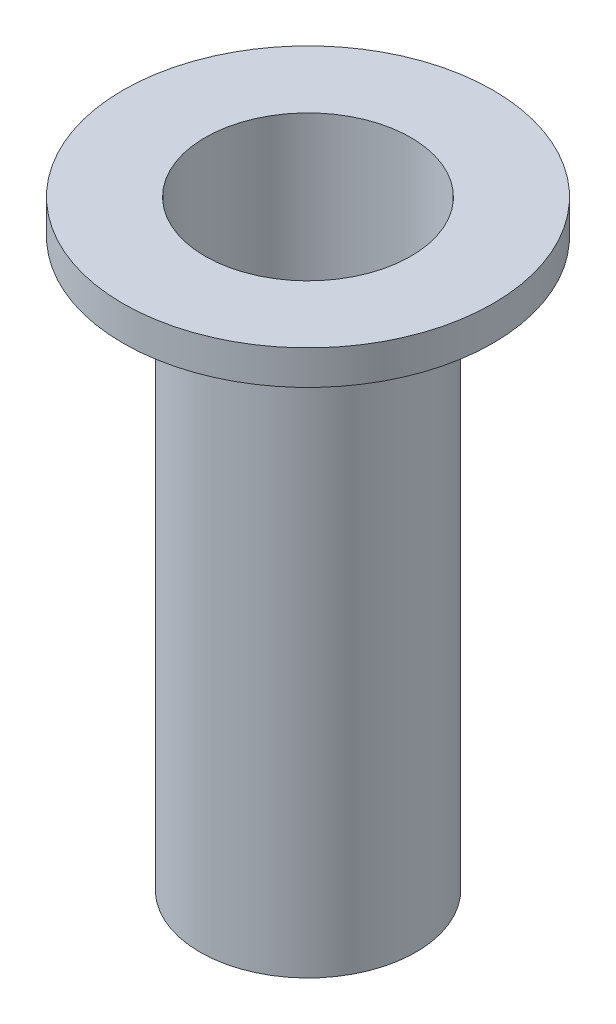
ISO-10303-21;
HEADER;
FILE_DESCRIPTION(('STEP AP214'),'2;1');
FILE_NAME('part.step','',(''),(''),'','','');
FILE_SCHEMA(('AUTOMOTIVE_DESIGN { 1 0 10303 214 1 1 1 1 }'));
ENDSEC;
DATA;
#1=APPLICATION_CONTEXT('core data for automotive mechanical design processes');
#2=APPLICATION_PROTOCOL_DEFINITION('international standard','automotive_design',2000,#1);
#3=PRODUCT_CONTEXT('',#1,'mechanical');
#4=PRODUCT('Part','Part','',(#3));
#5=PRODUCT_RELATED_PRODUCT_CATEGORY('part','',(#4));
#6=PRODUCT_DEFINITION_FORMATION('','',#4);
#7=PRODUCT_DEFINITION_CONTEXT('part definition',#1,'design');
#8=PRODUCT_DEFINITION('design','',#6,#7);
#9=PRODUCT_DEFINITION_SHAPE('','',#8);
#10=(LENGTH_UNIT() NAMED_UNIT(*) SI_UNIT(.MILLI.,.METRE.));
#11=(NAMED_UNIT(*) PLANE_ANGLE_UNIT() SI_UNIT($,.RADIAN.));
#12=(NAMED_UNIT(*) SI_UNIT($,.STERADIAN.) SOLID_ANGLE_UNIT());
#13=UNCERTAINTY_MEASURE_WITH_UNIT(LENGTH_MEASURE(1.E-05),#10,'distance_accuracy_value','');
#14=(GEOMETRIC_REPRESENTATION_CONTEXT(3) GLOBAL_UNCERTAINTY_ASSIGNED_CONTEXT((#13)) GLOBAL_UNIT_ASSIGNED_CONTEXT((#10,
#11,#12)) REPRESENTATION_CONTEXT('',''));
#15=CARTESIAN_POINT('',(0.,0.,0.));
#16=DIRECTION('',(0.,0.,1.));
#17=DIRECTION('',(1.,0.,0.));
#18=AXIS2_PLACEMENT_3D('',#15,#16,#17);
#19=CARTESIAN_POINT('',(0.,44.45,0.));
#20=DIRECTION('',(0.,-1.,0.));
#21=DIRECTION('',(0.,0.,-1.));
#22=AXIS2_PLACEMENT_3D('',#19,#20,#21);
#23=CYLINDRICAL_SURFACE('',#22,8.001);
#24=CARTESIAN_POINT('',(0.,40.9902955565163,0.));
#25=DIRECTION('',(0.,-1.,0.));
#26=DIRECTION('',(0.,0.,-1.));
#27=AXIS2_PLACEMENT_3D('',#24,#25,#26);
#28=CIRCLE('',#27,8.001);
#29=CARTESIAN_POINT('',(0.,40.9902955565163,-8.001));
#30=VERTEX_POINT('',#29);
#31=EDGE_CURVE('E56',#30,#30,#28,.T.);
#32=ORIENTED_EDGE('',*,*,#31,.T.);
#33=EDGE_LOOP('',(#32));
#34=FACE_BOUND('',#33,.T.);
#35=CARTESIAN_POINT('',(0.,0.,0.));
#36=DIRECTION('',(0.,1.,0.));
#37=DIRECTION('',(0.,0.,1.));
#38=AXIS2_PLACEMENT_3D('',#35,#36,#37);
#39=CIRCLE('',#38,8.001);
#40=CARTESIAN_POINT('',(0.,0.,8.001));
#41=VERTEX_POINT('',#40);
#42=EDGE_CURVE('E40',#41,#41,#39,.T.);
#43=ORIENTED_EDGE('',*,*,#42,.T.);
#44=EDGE_LOOP('',(#43));
#45=FACE_BOUND('',#44,.T.);
#46=ADVANCED_FACE('F33',(#34,#45),#23,.T.);
#47=CARTESIAN_POINT('',(0.,44.45,0.));
#48=DIRECTION('',(0.,1.,0.));
#49=DIRECTION('',(0.,0.,1.));
#50=AXIS2_PLACEMENT_3D('',#47,#48,#49);
#51=PLANE('',#50);
#52=CARTESIAN_POINT('',(0.,44.45,0.));
#53=DIRECTION('',(0.,1.,0.));
#54=DIRECTION('',(0.,0.,1.));
#55=AXIS2_PLACEMENT_3D('',#52,#53,#54);
#56=CIRCLE('',#55,7.62);
#57=CARTESIAN_POINT('',(0.,44.45,7.62));
#58=VERTEX_POINT('',#57);
#59=EDGE_CURVE('E48',#58,#58,#56,.T.);
#60=ORIENTED_EDGE('',*,*,#59,.F.);
#61=EDGE_LOOP('',(#60));
#62=FACE_BOUND('',#61,.T.);
#63=CARTESIAN_POINT('',(0.,44.45,0.));
#64=DIRECTION('',(0.,-1.,0.));
#65=DIRECTION('',(0.,0.,-1.));
#66=AXIS2_PLACEMENT_3D('',#63,#64,#65);
#67=CIRCLE('',#66,13.6980056010222);
#68=CARTESIAN_POINT('',(0.,44.45,-13.6980056010222));
#69=VERTEX_POINT('',#68);
#70=EDGE_CURVE('E62',#69,#69,#67,.T.);
#71=ORIENTED_EDGE('',*,*,#70,.F.);
#72=EDGE_LOOP('',(#71));
#73=FACE_BOUND('',#72,.T.);
#74=ADVANCED_FACE('F69',(#62,#73),#51,.T.);
#75=CARTESIAN_POINT('',(0.,0.,0.));
#76=DIRECTION('',(0.,1.,0.));
#77=DIRECTION('',(0.,0.,1.));
#78=AXIS2_PLACEMENT_3D('',#75,#76,#77);
#79=PLANE('',#78);
#80=CARTESIAN_POINT('',(0.,0.,0.));
#81=DIRECTION('',(0.,1.,0.));
#82=DIRECTION('',(0.,0.,1.));
#83=AXIS2_PLACEMENT_3D('',#80,#81,#82);
#84=CIRCLE('',#83,7.62);
#85=CARTESIAN_POINT('',(0.,0.,7.62));
#86=VERTEX_POINT('',#85);
#87=EDGE_CURVE('E10',#86,#86,#84,.T.);
#88=ORIENTED_EDGE('',*,*,#87,.T.);
#89=EDGE_LOOP('',(#88));
#90=FACE_BOUND('',#89,.T.);
#91=ORIENTED_EDGE('',*,*,#42,.F.);
#92=EDGE_LOOP('',(#91));
#93=FACE_BOUND('',#92,.T.);
#94=ADVANCED_FACE('F71',(#90,#93),#79,.F.);
#95=CARTESIAN_POINT('',(0.,1.27,0.));
#96=DIRECTION('',(0.,1.,0.));
#97=DIRECTION('',(0.,0.,1.));
#98=AXIS2_PLACEMENT_3D('',#95,#96,#97);
#99=CYLINDRICAL_SURFACE('',#98,7.62);
#100=CARTESIAN_POINT('',(0.,1.27,0.));
#101=DIRECTION('',(0.,1.,0.));
#102=DIRECTION('',(0.,0.,1.));
#103=AXIS2_PLACEMENT_3D('',#100,#101,#102);
#104=CIRCLE('',#103,7.62);
#105=CARTESIAN_POINT('',(0.,1.27,7.62));
#106=VERTEX_POINT('',#105);
#107=EDGE_CURVE('E44',#106,#106,#104,.T.);
#108=ORIENTED_EDGE('',*,*,#107,.F.);
#109=EDGE_LOOP('',(#108));
#110=FACE_BOUND('',#109,.T.);
#111=ORIENTED_EDGE('',*,*,#59,.T.);
#112=EDGE_LOOP('',(#111));
#113=FACE_BOUND('',#112,.T.);
#114=ADVANCED_FACE('F78',(#110,#113),#99,.F.);
#115=CARTESIAN_POINT('',(0.,1.27,0.));
#116=DIRECTION('',(0.,1.,0.));
#117=DIRECTION('',(0.,0.,1.));
#118=AXIS2_PLACEMENT_3D('',#115,#116,#117);
#119=PLANE('',#118);
#120=CARTESIAN_POINT('',(0.,1.27,0.));
#121=DIRECTION('',(0.,1.,0.));
#122=DIRECTION('',(0.,0.,1.));
#123=AXIS2_PLACEMENT_3D('',#120,#121,#122);
#124=CIRCLE('',#123,6.35);
#125=CARTESIAN_POINT('',(0.,1.27,6.35));
#126=VERTEX_POINT('',#125);
#127=EDGE_CURVE('E52',#126,#126,#124,.T.);
#128=ORIENTED_EDGE('',*,*,#127,.F.);
#129=EDGE_LOOP('',(#128));
#130=FACE_BOUND('',#129,.T.);
#131=ORIENTED_EDGE('',*,*,#107,.T.);
#132=EDGE_LOOP('',(#131));
#133=FACE_BOUND('',#132,.T.);
#134=ADVANCED_FACE('F85',(#130,#133),#119,.T.);
#135=CARTESIAN_POINT('',(0.,0.,0.));
#136=DIRECTION('',(0.,-1.,0.));
#137=DIRECTION('',(0.,0.,-1.));
#138=AXIS2_PLACEMENT_3D('',#135,#136,#137);
#139=CONICAL_SURFACE('',#138,7.62,0.785398163397447);
#140=ORIENTED_EDGE('',*,*,#127,.T.);
#141=EDGE_LOOP('',(#140));
#142=FACE_BOUND('',#141,.T.);
#143=ORIENTED_EDGE('',*,*,#87,.F.);
#144=EDGE_LOOP('',(#143));
#145=FACE_BOUND('',#144,.T.);
#146=ADVANCED_FACE('F35',(#142,#145),#139,.F.);
#147=CARTESIAN_POINT('',(0.,23.8054179696576,0.));
#148=DIRECTION('',(0.,-1.,0.));
#149=DIRECTION('',(0.,0.,-1.));
#150=AXIS2_PLACEMENT_3D('',#147,#148,#149);
#151=DEGENERATE_TOROIDAL_SURFACE('',#150,13.6980056010222,18.1045820303424,.T.);
#152=CARTESIAN_POINT('',(0.,41.91,0.));
#153=DIRECTION('',(0.,-1.,0.));
#154=DIRECTION('',(0.,0.,-1.));
#155=AXIS2_PLACEMENT_3D('',#152,#153,#154);
#156=CIRCLE('',#155,13.6980056010222);
#157=CARTESIAN_POINT('',(0.,41.91,-13.6980056010222));
#158=VERTEX_POINT('',#157);
#159=EDGE_CURVE('E59',#158,#158,#156,.T.);
#160=ORIENTED_EDGE('',*,*,#159,.T.);
#161=EDGE_LOOP('',(#160));
#162=FACE_BOUND('',#161,.T.);
#163=ORIENTED_EDGE('',*,*,#31,.F.);
#164=EDGE_LOOP('',(#163));
#165=FACE_BOUND('',#164,.T.);
#166=ADVANCED_FACE('F90',(#162,#165),#151,.F.);
#167=CARTESIAN_POINT('',(0.,1.27,0.));
#168=DIRECTION('',(0.,-1.,0.));
#169=DIRECTION('',(0.,0.,-1.));
#170=AXIS2_PLACEMENT_3D('',#167,#168,#169);
#171=CYLINDRICAL_SURFACE('',#170,13.6980056010222);
#172=ORIENTED_EDGE('',*,*,#70,.T.);
#173=EDGE_LOOP('',(#172));
#174=FACE_BOUND('',#173,.T.);
#175=ORIENTED_EDGE('',*,*,#159,.F.);
#176=EDGE_LOOP('',(#175));
#177=FACE_BOUND('',#176,.T.);
#178=ADVANCED_FACE('F66',(#174,#177),#171,.T.);
#179=CLOSED_SHELL('',(#46,#74,#94,#114,#134,#146,#166,#178));
#180=MANIFOLD_SOLID_BREP('B2',#179);
#181=ADVANCED_BREP_SHAPE_REPRESENTATION('',(#18,#180),#14);
#182=SHAPE_DEFINITION_REPRESENTATION(#9,#181);
ENDSEC;
END-ISO-10303-21;
